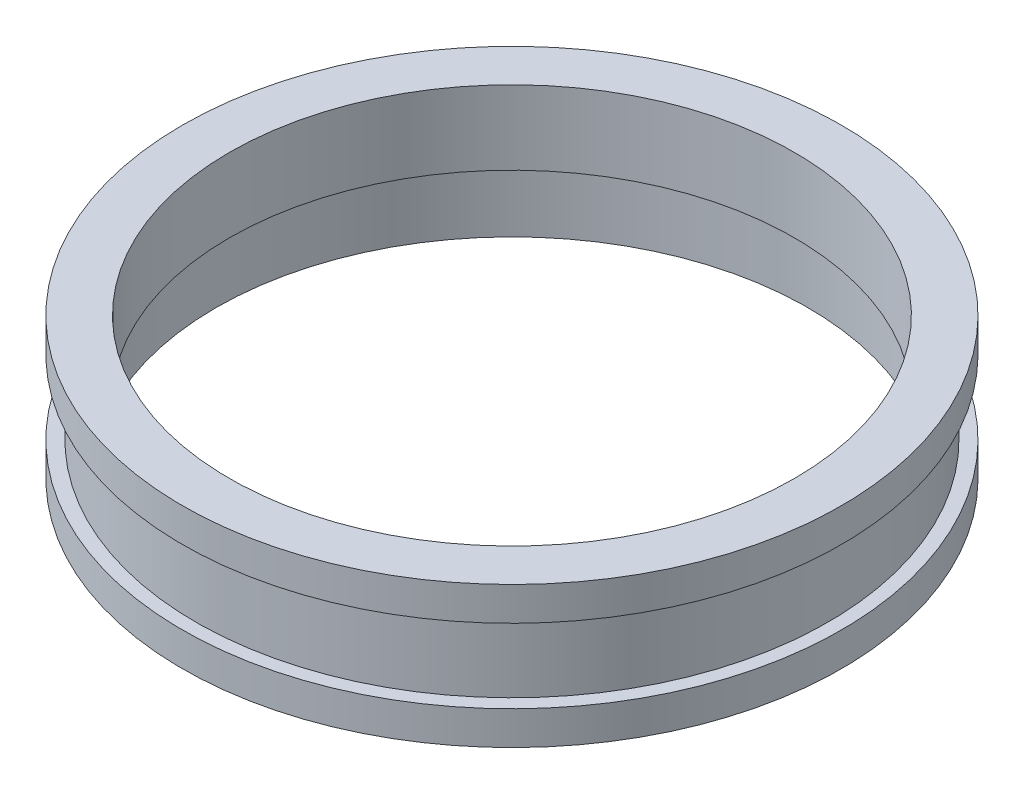
ISO-10303-21;
HEADER;
FILE_DESCRIPTION(('STEP AP214'),'2;1');
FILE_NAME('part.step','',(''),(''),'','','');
FILE_SCHEMA(('AUTOMOTIVE_DESIGN { 1 0 10303 214 1 1 1 1 }'));
ENDSEC;
DATA;
#1=APPLICATION_CONTEXT('core data for automotive mechanical design processes');
#2=APPLICATION_PROTOCOL_DEFINITION('international standard','automotive_design',2000,#1);
#3=PRODUCT_CONTEXT('',#1,'mechanical');
#4=PRODUCT('Part','Part','',(#3));
#5=PRODUCT_RELATED_PRODUCT_CATEGORY('part','',(#4));
#6=PRODUCT_DEFINITION_FORMATION('','',#4);
#7=PRODUCT_DEFINITION_CONTEXT('part definition',#1,'design');
#8=PRODUCT_DEFINITION('design','',#6,#7);
#9=PRODUCT_DEFINITION_SHAPE('','',#8);
#10=(LENGTH_UNIT() NAMED_UNIT(*) SI_UNIT(.MILLI.,.METRE.));
#11=(NAMED_UNIT(*) PLANE_ANGLE_UNIT() SI_UNIT($,.RADIAN.));
#12=(NAMED_UNIT(*) SI_UNIT($,.STERADIAN.) SOLID_ANGLE_UNIT());
#13=UNCERTAINTY_MEASURE_WITH_UNIT(LENGTH_MEASURE(1.E-05),#10,'distance_accuracy_value','');
#14=(GEOMETRIC_REPRESENTATION_CONTEXT(3) GLOBAL_UNCERTAINTY_ASSIGNED_CONTEXT((#13)) GLOBAL_UNIT_ASSIGNED_CONTEXT((#10,
#11,#12)) REPRESENTATION_CONTEXT('',''));
#15=CARTESIAN_POINT('',(0.,0.,0.));
#16=DIRECTION('',(0.,0.,1.));
#17=DIRECTION('',(1.,0.,0.));
#18=AXIS2_PLACEMENT_3D('',#15,#16,#17);
#19=CARTESIAN_POINT('',(0.,22.,0.));
#20=DIRECTION('',(0.,-1.,0.));
#21=DIRECTION('',(1.,0.,0.));
#22=AXIS2_PLACEMENT_3D('',#19,#20,#21);
#23=PLANE('',#22);
#24=CARTESIAN_POINT('',(0.,22.,0.));
#25=DIRECTION('',(0.,1.,0.));
#26=DIRECTION('',(-1.,0.,0.));
#27=AXIS2_PLACEMENT_3D('',#24,#25,#26);
#28=CIRCLE('',#27,42.);
#29=CARTESIAN_POINT('',(-42.,22.,0.));
#30=VERTEX_POINT('',#29);
#31=EDGE_CURVE('E10',#30,#30,#28,.T.);
#32=ORIENTED_EDGE('',*,*,#31,.T.);
#33=EDGE_LOOP('',(#32));
#34=FACE_BOUND('',#33,.T.);
#35=CARTESIAN_POINT('',(0.,22.,0.));
#36=DIRECTION('',(0.,1.,0.));
#37=DIRECTION('',(-1.,0.,0.));
#38=AXIS2_PLACEMENT_3D('',#35,#36,#37);
#39=CIRCLE('',#38,43.9999999999998);
#40=CARTESIAN_POINT('',(-43.9999999999998,22.,0.));
#41=VERTEX_POINT('',#40);
#42=EDGE_CURVE('E66',#41,#41,#39,.T.);
#43=ORIENTED_EDGE('',*,*,#42,.F.);
#44=EDGE_LOOP('',(#43));
#45=FACE_BOUND('',#44,.T.);
#46=ADVANCED_FACE('F32',(#34,#45),#23,.T.);
#47=CARTESIAN_POINT('',(0.,15.8556149732621,0.));
#48=DIRECTION('',(0.,1.,0.));
#49=DIRECTION('',(-1.,0.,0.));
#50=AXIS2_PLACEMENT_3D('',#47,#48,#49);
#51=CYLINDRICAL_SURFACE('',#50,42.);
#52=CARTESIAN_POINT('',(0.,33.,0.));
#53=DIRECTION('',(0.,1.,0.));
#54=DIRECTION('',(-1.,0.,0.));
#55=AXIS2_PLACEMENT_3D('',#52,#53,#54);
#56=CIRCLE('',#55,42.);
#57=CARTESIAN_POINT('',(-42.,33.,0.));
#58=VERTEX_POINT('',#57);
#59=EDGE_CURVE('E38',#58,#58,#56,.T.);
#60=ORIENTED_EDGE('',*,*,#59,.T.);
#61=EDGE_LOOP('',(#60));
#62=FACE_BOUND('',#61,.T.);
#63=ORIENTED_EDGE('',*,*,#31,.F.);
#64=EDGE_LOOP('',(#63));
#65=FACE_BOUND('',#64,.T.);
#66=ADVANCED_FACE('F74',(#62,#65),#51,.F.);
#67=CARTESIAN_POINT('',(0.,33.,0.));
#68=DIRECTION('',(0.,-1.,0.));
#69=DIRECTION('',(1.,0.,0.));
#70=AXIS2_PLACEMENT_3D('',#67,#68,#69);
#71=PLANE('',#70);
#72=ORIENTED_EDGE('',*,*,#59,.F.);
#73=EDGE_LOOP('',(#72));
#74=FACE_BOUND('',#73,.T.);
#75=CARTESIAN_POINT('',(0.,33.,0.));
#76=DIRECTION('',(0.,1.,0.));
#77=DIRECTION('',(-1.,0.,0.));
#78=AXIS2_PLACEMENT_3D('',#75,#76,#77);
#79=CIRCLE('',#78,49.);
#80=CARTESIAN_POINT('',(-49.,33.,0.));
#81=VERTEX_POINT('',#80);
#82=EDGE_CURVE('E42',#81,#81,#79,.T.);
#83=ORIENTED_EDGE('',*,*,#82,.T.);
#84=EDGE_LOOP('',(#83));
#85=FACE_BOUND('',#84,.T.);
#86=ADVANCED_FACE('F78',(#74,#85),#71,.F.);
#87=CARTESIAN_POINT('',(0.,15.8556149732621,0.));
#88=DIRECTION('',(0.,1.,0.));
#89=DIRECTION('',(-1.,0.,0.));
#90=AXIS2_PLACEMENT_3D('',#87,#88,#89);
#91=CYLINDRICAL_SURFACE('',#90,49.);
#92=ORIENTED_EDGE('',*,*,#82,.F.);
#93=EDGE_LOOP('',(#92));
#94=FACE_BOUND('',#93,.T.);
#95=CARTESIAN_POINT('',(0.,28.,0.));
#96=DIRECTION('',(0.,1.,0.));
#97=DIRECTION('',(-1.,0.,0.));
#98=AXIS2_PLACEMENT_3D('',#95,#96,#97);
#99=CIRCLE('',#98,49.);
#100=CARTESIAN_POINT('',(-49.,28.,0.));
#101=VERTEX_POINT('',#100);
#102=EDGE_CURVE('E46',#101,#101,#99,.T.);
#103=ORIENTED_EDGE('',*,*,#102,.T.);
#104=EDGE_LOOP('',(#103));
#105=FACE_BOUND('',#104,.T.);
#106=ADVANCED_FACE('F82',(#94,#105),#91,.T.);
#107=CARTESIAN_POINT('',(0.,28.,0.));
#108=DIRECTION('',(0.,1.,0.));
#109=DIRECTION('',(-1.,0.,0.));
#110=AXIS2_PLACEMENT_3D('',#107,#108,#109);
#111=PLANE('',#110);
#112=ORIENTED_EDGE('',*,*,#102,.F.);
#113=EDGE_LOOP('',(#112));
#114=FACE_BOUND('',#113,.T.);
#115=CARTESIAN_POINT('',(0.,28.,0.));
#116=DIRECTION('',(0.,1.,0.));
#117=DIRECTION('',(-1.,0.,0.));
#118=AXIS2_PLACEMENT_3D('',#115,#116,#117);
#119=CIRCLE('',#118,47.);
#120=CARTESIAN_POINT('',(-47.,28.,0.));
#121=VERTEX_POINT('',#120);
#122=EDGE_CURVE('E51',#121,#121,#119,.T.);
#123=ORIENTED_EDGE('',*,*,#122,.T.);
#124=EDGE_LOOP('',(#123));
#125=FACE_BOUND('',#124,.T.);
#126=ADVANCED_FACE('F89',(#114,#125),#111,.F.);
#127=CARTESIAN_POINT('',(0.,15.8556149732621,0.));
#128=DIRECTION('',(0.,1.,0.));
#129=DIRECTION('',(-1.,0.,0.));
#130=AXIS2_PLACEMENT_3D('',#127,#128,#129);
#131=CYLINDRICAL_SURFACE('',#130,47.);
#132=ORIENTED_EDGE('',*,*,#122,.F.);
#133=EDGE_LOOP('',(#132));
#134=FACE_BOUND('',#133,.T.);
#135=CARTESIAN_POINT('',(0.,17.,0.));
#136=DIRECTION('',(0.,1.,0.));
#137=DIRECTION('',(-1.,0.,0.));
#138=AXIS2_PLACEMENT_3D('',#135,#136,#137);
#139=CIRCLE('',#138,47.);
#140=CARTESIAN_POINT('',(-47.,17.,0.));
#141=VERTEX_POINT('',#140);
#142=EDGE_CURVE('E54',#141,#141,#139,.T.);
#143=ORIENTED_EDGE('',*,*,#142,.T.);
#144=EDGE_LOOP('',(#143));
#145=FACE_BOUND('',#144,.T.);
#146=ADVANCED_FACE('F93',(#134,#145),#131,.T.);
#147=CARTESIAN_POINT('',(0.,17.,0.));
#148=DIRECTION('',(0.,-1.,0.));
#149=DIRECTION('',(1.,0.,0.));
#150=AXIS2_PLACEMENT_3D('',#147,#148,#149);
#151=PLANE('',#150);
#152=ORIENTED_EDGE('',*,*,#142,.F.);
#153=EDGE_LOOP('',(#152));
#154=FACE_BOUND('',#153,.T.);
#155=CARTESIAN_POINT('',(0.,17.,0.));
#156=DIRECTION('',(0.,1.,0.));
#157=DIRECTION('',(-1.,0.,0.));
#158=AXIS2_PLACEMENT_3D('',#155,#156,#157);
#159=CIRCLE('',#158,48.9999999999998);
#160=CARTESIAN_POINT('',(-48.9999999999998,17.,0.));
#161=VERTEX_POINT('',#160);
#162=EDGE_CURVE('E57',#161,#161,#159,.T.);
#163=ORIENTED_EDGE('',*,*,#162,.T.);
#164=EDGE_LOOP('',(#163));
#165=FACE_BOUND('',#164,.T.);
#166=ADVANCED_FACE('F97',(#154,#165),#151,.F.);
#167=CARTESIAN_POINT('',(0.,15.8556149732621,0.));
#168=DIRECTION('',(0.,1.,0.));
#169=DIRECTION('',(-1.,0.,0.));
#170=AXIS2_PLACEMENT_3D('',#167,#168,#169);
#171=CYLINDRICAL_SURFACE('',#170,48.9999999999998);
#172=ORIENTED_EDGE('',*,*,#162,.F.);
#173=EDGE_LOOP('',(#172));
#174=FACE_BOUND('',#173,.T.);
#175=CARTESIAN_POINT('',(0.,12.,0.));
#176=DIRECTION('',(0.,1.,0.));
#177=DIRECTION('',(-1.,0.,0.));
#178=AXIS2_PLACEMENT_3D('',#175,#176,#177);
#179=CIRCLE('',#178,48.9999999999998);
#180=CARTESIAN_POINT('',(-48.9999999999998,12.,0.));
#181=VERTEX_POINT('',#180);
#182=EDGE_CURVE('E60',#181,#181,#179,.T.);
#183=ORIENTED_EDGE('',*,*,#182,.T.);
#184=EDGE_LOOP('',(#183));
#185=FACE_BOUND('',#184,.T.);
#186=ADVANCED_FACE('F101',(#174,#185),#171,.T.);
#187=CARTESIAN_POINT('',(0.,12.,0.));
#188=DIRECTION('',(0.,1.,0.));
#189=DIRECTION('',(-1.,0.,0.));
#190=AXIS2_PLACEMENT_3D('',#187,#188,#189);
#191=PLANE('',#190);
#192=ORIENTED_EDGE('',*,*,#182,.F.);
#193=EDGE_LOOP('',(#192));
#194=FACE_BOUND('',#193,.T.);
#195=CARTESIAN_POINT('',(0.,12.,0.));
#196=DIRECTION('',(0.,1.,0.));
#197=DIRECTION('',(-1.,0.,0.));
#198=AXIS2_PLACEMENT_3D('',#195,#196,#197);
#199=CIRCLE('',#198,43.9999999999998);
#200=CARTESIAN_POINT('',(-43.9999999999998,12.,0.));
#201=VERTEX_POINT('',#200);
#202=EDGE_CURVE('E63',#201,#201,#199,.T.);
#203=ORIENTED_EDGE('',*,*,#202,.T.);
#204=EDGE_LOOP('',(#203));
#205=FACE_BOUND('',#204,.T.);
#206=ADVANCED_FACE('F105',(#194,#205),#191,.F.);
#207=CARTESIAN_POINT('',(0.,15.8556149732621,0.));
#208=DIRECTION('',(0.,1.,0.));
#209=DIRECTION('',(-1.,0.,0.));
#210=AXIS2_PLACEMENT_3D('',#207,#208,#209);
#211=CYLINDRICAL_SURFACE('',#210,43.9999999999998);
#212=ORIENTED_EDGE('',*,*,#42,.T.);
#213=EDGE_LOOP('',(#212));
#214=FACE_BOUND('',#213,.T.);
#215=ORIENTED_EDGE('',*,*,#202,.F.);
#216=EDGE_LOOP('',(#215));
#217=FACE_BOUND('',#216,.T.);
#218=ADVANCED_FACE('F70',(#214,#217),#211,.F.);
#219=CLOSED_SHELL('',(#46,#66,#86,#106,#126,#146,#166,#186,#206,#218));
#220=MANIFOLD_SOLID_BREP('B2',#219);
#221=ADVANCED_BREP_SHAPE_REPRESENTATION('',(#18,#220),#14);
#222=SHAPE_DEFINITION_REPRESENTATION(#9,#221);
ENDSEC;
END-ISO-10303-21;
